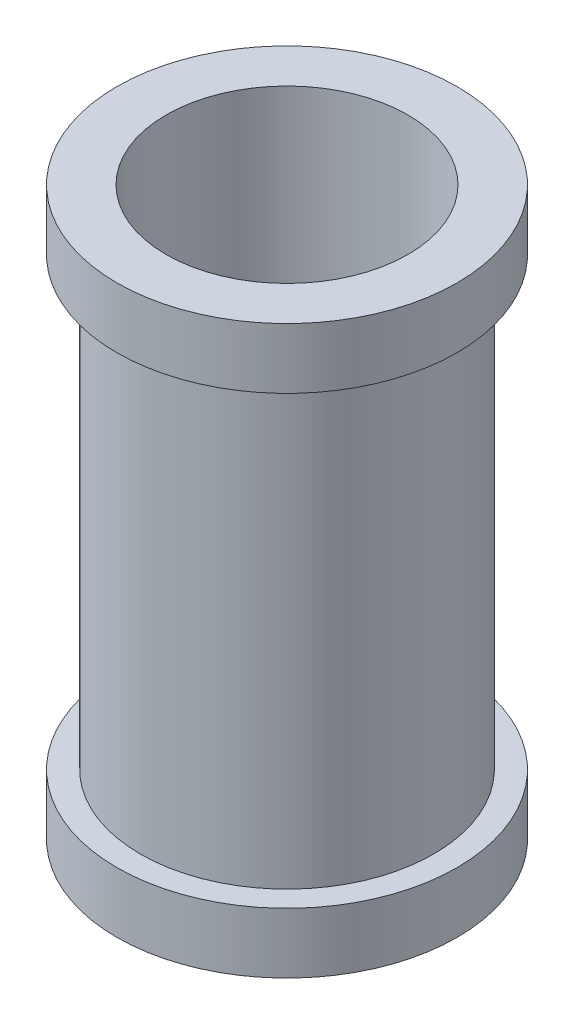
ISO-10303-21;
HEADER;
FILE_DESCRIPTION(('STEP AP214'),'2;1');
FILE_NAME('part.step','',(''),(''),'','','');
FILE_SCHEMA(('AUTOMOTIVE_DESIGN { 1 0 10303 214 1 1 1 1 }'));
ENDSEC;
DATA;
#1=APPLICATION_CONTEXT('core data for automotive mechanical design processes');
#2=APPLICATION_PROTOCOL_DEFINITION('international standard','automotive_design',2000,#1);
#3=PRODUCT_CONTEXT('',#1,'mechanical');
#4=PRODUCT('Part','Part','',(#3));
#5=PRODUCT_RELATED_PRODUCT_CATEGORY('part','',(#4));
#6=PRODUCT_DEFINITION_FORMATION('','',#4);
#7=PRODUCT_DEFINITION_CONTEXT('part definition',#1,'design');
#8=PRODUCT_DEFINITION('design','',#6,#7);
#9=PRODUCT_DEFINITION_SHAPE('','',#8);
#10=(LENGTH_UNIT() NAMED_UNIT(*) SI_UNIT(.MILLI.,.METRE.));
#11=(NAMED_UNIT(*) PLANE_ANGLE_UNIT() SI_UNIT($,.RADIAN.));
#12=(NAMED_UNIT(*) SI_UNIT($,.STERADIAN.) SOLID_ANGLE_UNIT());
#13=UNCERTAINTY_MEASURE_WITH_UNIT(LENGTH_MEASURE(1.E-05),#10,'distance_accuracy_value','');
#14=(GEOMETRIC_REPRESENTATION_CONTEXT(3) GLOBAL_UNCERTAINTY_ASSIGNED_CONTEXT((#13)) GLOBAL_UNIT_ASSIGNED_CONTEXT((#10,
#11,#12)) REPRESENTATION_CONTEXT('',''));
#15=CARTESIAN_POINT('',(0.,0.,0.));
#16=DIRECTION('',(0.,0.,1.));
#17=DIRECTION('',(1.,0.,0.));
#18=AXIS2_PLACEMENT_3D('',#15,#16,#17);
#19=CARTESIAN_POINT('',(0.,95.25,0.));
#20=DIRECTION('',(0.,-1.,0.));
#21=DIRECTION('',(0.,0.,-1.));
#22=AXIS2_PLACEMENT_3D('',#19,#20,#21);
#23=CYLINDRICAL_SURFACE('',#22,24.638);
#24=CARTESIAN_POINT('',(0.,10.16,0.));
#25=DIRECTION('',(0.,1.,0.));
#26=DIRECTION('',(0.,0.,1.));
#27=AXIS2_PLACEMENT_3D('',#24,#25,#26);
#28=CIRCLE('',#27,24.638);
#29=CARTESIAN_POINT('',(0.,10.16,24.638));
#30=VERTEX_POINT('',#29);
#31=EDGE_CURVE('E45',#30,#30,#28,.T.);
#32=ORIENTED_EDGE('',*,*,#31,.T.);
#33=EDGE_LOOP('',(#32));
#34=FACE_BOUND('',#33,.T.);
#35=CARTESIAN_POINT('',(0.,85.09,0.));
#36=DIRECTION('',(0.,1.,0.));
#37=DIRECTION('',(0.,0.,1.));
#38=AXIS2_PLACEMENT_3D('',#35,#36,#37);
#39=CIRCLE('',#38,24.638);
#40=CARTESIAN_POINT('',(0.,85.09,24.638));
#41=VERTEX_POINT('',#40);
#42=EDGE_CURVE('E10',#41,#41,#39,.T.);
#43=ORIENTED_EDGE('',*,*,#42,.F.);
#44=EDGE_LOOP('',(#43));
#45=FACE_BOUND('',#44,.T.);
#46=ADVANCED_FACE('F37',(#34,#45),#23,.T.);
#47=CARTESIAN_POINT('',(0.,10.16,0.));
#48=DIRECTION('',(0.,-1.,0.));
#49=DIRECTION('',(0.,0.,-1.));
#50=AXIS2_PLACEMENT_3D('',#47,#48,#49);
#51=CYLINDRICAL_SURFACE('',#50,28.575);
#52=CARTESIAN_POINT('',(0.,10.16,0.));
#53=DIRECTION('',(0.,1.,0.));
#54=DIRECTION('',(0.,0.,1.));
#55=AXIS2_PLACEMENT_3D('',#52,#53,#54);
#56=CIRCLE('',#55,28.575);
#57=CARTESIAN_POINT('',(0.,10.16,28.575));
#58=VERTEX_POINT('',#57);
#59=EDGE_CURVE('E50',#58,#58,#56,.T.);
#60=ORIENTED_EDGE('',*,*,#59,.F.);
#61=EDGE_LOOP('',(#60));
#62=FACE_BOUND('',#61,.T.);
#63=CARTESIAN_POINT('',(0.,0.,0.));
#64=DIRECTION('',(0.,1.,0.));
#65=DIRECTION('',(0.,0.,1.));
#66=AXIS2_PLACEMENT_3D('',#63,#64,#65);
#67=CIRCLE('',#66,28.575);
#68=CARTESIAN_POINT('',(0.,0.,28.575));
#69=VERTEX_POINT('',#68);
#70=EDGE_CURVE('E56',#69,#69,#67,.T.);
#71=ORIENTED_EDGE('',*,*,#70,.T.);
#72=EDGE_LOOP('',(#71));
#73=FACE_BOUND('',#72,.T.);
#74=ADVANCED_FACE('F39',(#62,#73),#51,.T.);
#75=CARTESIAN_POINT('',(0.,10.16,0.));
#76=DIRECTION('',(0.,1.,0.));
#77=DIRECTION('',(0.,0.,1.));
#78=AXIS2_PLACEMENT_3D('',#75,#76,#77);
#79=PLANE('',#78);
#80=ORIENTED_EDGE('',*,*,#31,.F.);
#81=EDGE_LOOP('',(#80));
#82=FACE_BOUND('',#81,.T.);
#83=ORIENTED_EDGE('',*,*,#59,.T.);
#84=EDGE_LOOP('',(#83));
#85=FACE_BOUND('',#84,.T.);
#86=ADVANCED_FACE('F101',(#82,#85),#79,.T.);
#87=CARTESIAN_POINT('',(0.,0.,0.));
#88=DIRECTION('',(0.,1.,0.));
#89=DIRECTION('',(0.,0.,1.));
#90=AXIS2_PLACEMENT_3D('',#87,#88,#89);
#91=PLANE('',#90);
#92=CARTESIAN_POINT('',(0.,0.,0.));
#93=DIRECTION('',(0.,1.,0.));
#94=DIRECTION('',(0.,0.,1.));
#95=AXIS2_PLACEMENT_3D('',#92,#93,#94);
#96=CIRCLE('',#95,20.32);
#97=CARTESIAN_POINT('',(0.,0.,20.32));
#98=VERTEX_POINT('',#97);
#99=EDGE_CURVE('E72',#98,#98,#96,.T.);
#100=ORIENTED_EDGE('',*,*,#99,.T.);
#101=EDGE_LOOP('',(#100));
#102=FACE_BOUND('',#101,.T.);
#103=ORIENTED_EDGE('',*,*,#70,.F.);
#104=EDGE_LOOP('',(#103));
#105=FACE_BOUND('',#104,.T.);
#106=ADVANCED_FACE('F94',(#102,#105),#91,.F.);
#107=CARTESIAN_POINT('',(0.,85.09,0.));
#108=DIRECTION('',(0.,1.,0.));
#109=DIRECTION('',(0.,0.,1.));
#110=AXIS2_PLACEMENT_3D('',#107,#108,#109);
#111=CYLINDRICAL_SURFACE('',#110,28.575);
#112=CARTESIAN_POINT('',(0.,85.09,0.));
#113=DIRECTION('',(0.,1.,0.));
#114=DIRECTION('',(0.,0.,1.));
#115=AXIS2_PLACEMENT_3D('',#112,#113,#114);
#116=CIRCLE('',#115,28.575);
#117=CARTESIAN_POINT('',(0.,85.09,28.575));
#118=VERTEX_POINT('',#117);
#119=EDGE_CURVE('E63',#118,#118,#116,.T.);
#120=ORIENTED_EDGE('',*,*,#119,.T.);
#121=EDGE_LOOP('',(#120));
#122=FACE_BOUND('',#121,.T.);
#123=CARTESIAN_POINT('',(0.,95.25,0.));
#124=DIRECTION('',(0.,1.,0.));
#125=DIRECTION('',(0.,0.,1.));
#126=AXIS2_PLACEMENT_3D('',#123,#124,#125);
#127=CIRCLE('',#126,28.575);
#128=CARTESIAN_POINT('',(0.,95.25,28.575));
#129=VERTEX_POINT('',#128);
#130=EDGE_CURVE('E59',#129,#129,#127,.T.);
#131=ORIENTED_EDGE('',*,*,#130,.F.);
#132=EDGE_LOOP('',(#131));
#133=FACE_BOUND('',#132,.T.);
#134=ADVANCED_FACE('F92',(#122,#133),#111,.T.);
#135=CARTESIAN_POINT('',(0.,85.09,0.));
#136=DIRECTION('',(0.,1.,0.));
#137=DIRECTION('',(0.,0.,1.));
#138=AXIS2_PLACEMENT_3D('',#135,#136,#137);
#139=PLANE('',#138);
#140=ORIENTED_EDGE('',*,*,#42,.T.);
#141=EDGE_LOOP('',(#140));
#142=FACE_BOUND('',#141,.T.);
#143=ORIENTED_EDGE('',*,*,#119,.F.);
#144=EDGE_LOOP('',(#143));
#145=FACE_BOUND('',#144,.T.);
#146=ADVANCED_FACE('F88',(#142,#145),#139,.F.);
#147=CARTESIAN_POINT('',(0.,95.25,0.));
#148=DIRECTION('',(0.,1.,0.));
#149=DIRECTION('',(0.,0.,1.));
#150=AXIS2_PLACEMENT_3D('',#147,#148,#149);
#151=PLANE('',#150);
#152=CARTESIAN_POINT('',(0.,95.25,0.));
#153=DIRECTION('',(0.,1.,0.));
#154=DIRECTION('',(0.,0.,1.));
#155=AXIS2_PLACEMENT_3D('',#152,#153,#154);
#156=CIRCLE('',#155,20.32);
#157=CARTESIAN_POINT('',(0.,95.25,20.32));
#158=VERTEX_POINT('',#157);
#159=EDGE_CURVE('E77',#158,#158,#156,.T.);
#160=ORIENTED_EDGE('',*,*,#159,.F.);
#161=EDGE_LOOP('',(#160));
#162=FACE_BOUND('',#161,.T.);
#163=ORIENTED_EDGE('',*,*,#130,.T.);
#164=EDGE_LOOP('',(#163));
#165=FACE_BOUND('',#164,.T.);
#166=ADVANCED_FACE('F85',(#162,#165),#151,.T.);
#167=CARTESIAN_POINT('',(0.,-8.89000000000002,0.));
#168=DIRECTION('',(0.,1.,0.));
#169=DIRECTION('',(0.,0.,1.));
#170=AXIS2_PLACEMENT_3D('',#167,#168,#169);
#171=CYLINDRICAL_SURFACE('',#170,20.32);
#172=ORIENTED_EDGE('',*,*,#159,.T.);
#173=EDGE_LOOP('',(#172));
#174=FACE_BOUND('',#173,.T.);
#175=ORIENTED_EDGE('',*,*,#99,.F.);
#176=EDGE_LOOP('',(#175));
#177=FACE_BOUND('',#176,.T.);
#178=ADVANCED_FACE('F82',(#174,#177),#171,.F.);
#179=CLOSED_SHELL('',(#46,#74,#86,#106,#134,#146,#166,#178));
#180=MANIFOLD_SOLID_BREP('B2',#179);
#181=ADVANCED_BREP_SHAPE_REPRESENTATION('',(#18,#180),#14);
#182=SHAPE_DEFINITION_REPRESENTATION(#9,#181);
ENDSEC;
END-ISO-10303-21;
